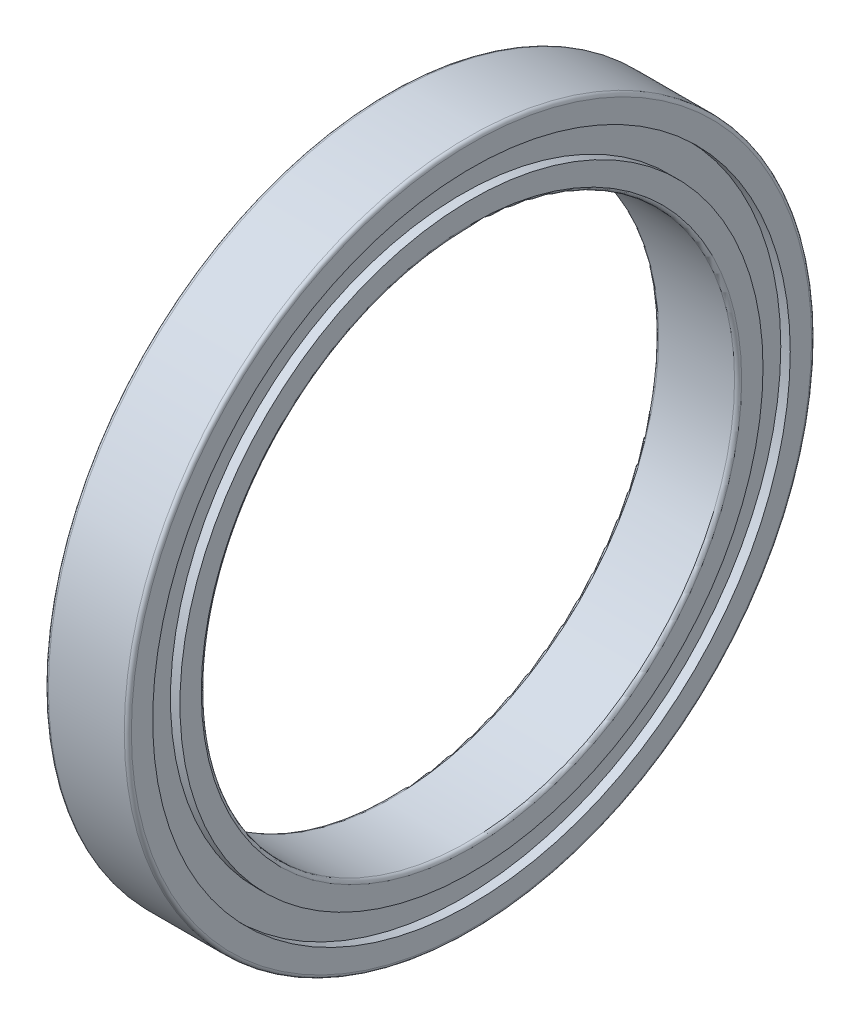
ISO-10303-21;
HEADER;
FILE_DESCRIPTION(('STEP AP214'),'2;1');
FILE_NAME('part.step','',(''),(''),'','','');
FILE_SCHEMA(('AUTOMOTIVE_DESIGN { 1 0 10303 214 1 1 1 1 }'));
ENDSEC;
DATA;
#1=APPLICATION_CONTEXT('core data for automotive mechanical design processes');
#2=APPLICATION_PROTOCOL_DEFINITION('international standard','automotive_design',2000,#1);
#3=PRODUCT_CONTEXT('',#1,'mechanical');
#4=PRODUCT('Part','Part','',(#3));
#5=PRODUCT_RELATED_PRODUCT_CATEGORY('part','',(#4));
#6=PRODUCT_DEFINITION_FORMATION('','',#4);
#7=PRODUCT_DEFINITION_CONTEXT('part definition',#1,'design');
#8=PRODUCT_DEFINITION('design','',#6,#7);
#9=PRODUCT_DEFINITION_SHAPE('','',#8);
#10=(LENGTH_UNIT() NAMED_UNIT(*) SI_UNIT(.MILLI.,.METRE.));
#11=(NAMED_UNIT(*) PLANE_ANGLE_UNIT() SI_UNIT($,.RADIAN.));
#12=(NAMED_UNIT(*) SI_UNIT($,.STERADIAN.) SOLID_ANGLE_UNIT());
#13=UNCERTAINTY_MEASURE_WITH_UNIT(LENGTH_MEASURE(1.E-05),#10,'distance_accuracy_value','');
#14=(GEOMETRIC_REPRESENTATION_CONTEXT(3) GLOBAL_UNCERTAINTY_ASSIGNED_CONTEXT((#13)) GLOBAL_UNIT_ASSIGNED_CONTEXT((#10,
#11,#12)) REPRESENTATION_CONTEXT('',''));
#15=CARTESIAN_POINT('',(0.,0.,0.));
#16=DIRECTION('',(0.,0.,1.));
#17=DIRECTION('',(1.,0.,0.));
#18=AXIS2_PLACEMENT_3D('',#15,#16,#17);
#19=CARTESIAN_POINT('',(-3.2,0.,0.));
#20=DIRECTION('',(1.,0.,0.));
#21=DIRECTION('',(0.,0.,-1.));
#22=AXIS2_PLACEMENT_3D('',#19,#20,#21);
#23=TOROIDAL_SURFACE('',#22,28.7,0.3);
#24=CARTESIAN_POINT('',(-3.5,0.,0.));
#25=DIRECTION('',(1.,0.,0.));
#26=DIRECTION('',(0.,0.,-1.));
#27=AXIS2_PLACEMENT_3D('',#24,#25,#26);
#28=CIRCLE('',#27,28.7);
#29=CARTESIAN_POINT('',(-3.5,0.,-28.7));
#30=VERTEX_POINT('',#29);
#31=EDGE_CURVE('E10',#30,#30,#28,.T.);
#32=ORIENTED_EDGE('',*,*,#31,.T.);
#33=EDGE_LOOP('',(#32));
#34=FACE_BOUND('',#33,.T.);
#35=CARTESIAN_POINT('',(-3.2,0.,0.));
#36=DIRECTION('',(1.,0.,0.));
#37=DIRECTION('',(0.,0.,-1.));
#38=AXIS2_PLACEMENT_3D('',#35,#36,#37);
#39=CIRCLE('',#38,29.);
#40=CARTESIAN_POINT('',(-3.2,0.,-29.));
#41=VERTEX_POINT('',#40);
#42=EDGE_CURVE('E116',#41,#41,#39,.T.);
#43=ORIENTED_EDGE('',*,*,#42,.F.);
#44=EDGE_LOOP('',(#43));
#45=FACE_BOUND('',#44,.T.);
#46=ADVANCED_FACE('F15',(#34,#45),#23,.T.);
#47=CARTESIAN_POINT('',(-3.5,26.9,0.));
#48=DIRECTION('',(1.,0.,0.));
#49=DIRECTION('',(0.,1.,0.));
#50=AXIS2_PLACEMENT_3D('',#47,#48,#49);
#51=PLANE('',#50);
#52=CARTESIAN_POINT('',(-3.5,0.,0.));
#53=DIRECTION('',(1.,0.,0.));
#54=DIRECTION('',(0.,0.,-1.));
#55=AXIS2_PLACEMENT_3D('',#52,#53,#54);
#56=CIRCLE('',#55,26.9);
#57=CARTESIAN_POINT('',(-3.5,0.,-26.9));
#58=VERTEX_POINT('',#57);
#59=EDGE_CURVE('E25',#58,#58,#56,.T.);
#60=ORIENTED_EDGE('',*,*,#59,.T.);
#61=EDGE_LOOP('',(#60));
#62=FACE_BOUND('',#61,.T.);
#63=ORIENTED_EDGE('',*,*,#31,.F.);
#64=EDGE_LOOP('',(#63));
#65=FACE_BOUND('',#64,.T.);
#66=ADVANCED_FACE('F187',(#62,#65),#51,.F.);
#67=CARTESIAN_POINT('',(3.5,0.,0.));
#68=DIRECTION('',(-1.,0.,0.));
#69=DIRECTION('',(0.,0.,-1.));
#70=AXIS2_PLACEMENT_3D('',#67,#68,#69);
#71=CYLINDRICAL_SURFACE('',#70,26.9);
#72=ORIENTED_EDGE('',*,*,#59,.F.);
#73=EDGE_LOOP('',(#72));
#74=FACE_BOUND('',#73,.T.);
#75=CARTESIAN_POINT('',(-2.7,0.,0.));
#76=DIRECTION('',(1.,0.,0.));
#77=DIRECTION('',(0.,0.,-1.));
#78=AXIS2_PLACEMENT_3D('',#75,#76,#77);
#79=CIRCLE('',#78,26.9);
#80=CARTESIAN_POINT('',(-2.7,0.,-26.9));
#81=VERTEX_POINT('',#80);
#82=EDGE_CURVE('E96',#81,#81,#79,.T.);
#83=ORIENTED_EDGE('',*,*,#82,.T.);
#84=EDGE_LOOP('',(#83));
#85=FACE_BOUND('',#84,.T.);
#86=ADVANCED_FACE('F192',(#74,#85),#71,.F.);
#87=CARTESIAN_POINT('',(-2.7,24.6,0.));
#88=DIRECTION('',(1.,0.,0.));
#89=DIRECTION('',(0.,1.,0.));
#90=AXIS2_PLACEMENT_3D('',#87,#88,#89);
#91=PLANE('',#90);
#92=CARTESIAN_POINT('',(-2.7,0.,0.));
#93=DIRECTION('',(1.,0.,0.));
#94=DIRECTION('',(0.,0.,-1.));
#95=AXIS2_PLACEMENT_3D('',#92,#93,#94);
#96=CIRCLE('',#95,24.6);
#97=CARTESIAN_POINT('',(-2.7,0.,-24.6));
#98=VERTEX_POINT('',#97);
#99=EDGE_CURVE('E103',#98,#98,#96,.T.);
#100=ORIENTED_EDGE('',*,*,#99,.T.);
#101=EDGE_LOOP('',(#100));
#102=FACE_BOUND('',#101,.T.);
#103=ORIENTED_EDGE('',*,*,#82,.F.);
#104=EDGE_LOOP('',(#103));
#105=FACE_BOUND('',#104,.T.);
#106=ADVANCED_FACE('F203',(#102,#105),#91,.F.);
#107=CARTESIAN_POINT('',(3.2,0.,0.));
#108=DIRECTION('',(1.,0.,0.));
#109=DIRECTION('',(0.,0.,-1.));
#110=AXIS2_PLACEMENT_3D('',#107,#108,#109);
#111=TOROIDAL_SURFACE('',#110,22.8,0.3);
#112=CARTESIAN_POINT('',(3.5,0.,0.));
#113=DIRECTION('',(1.,0.,0.));
#114=DIRECTION('',(0.,0.,-1.));
#115=AXIS2_PLACEMENT_3D('',#112,#113,#114);
#116=CIRCLE('',#115,22.8);
#117=CARTESIAN_POINT('',(3.5,0.,-22.8));
#118=VERTEX_POINT('',#117);
#119=EDGE_CURVE('E136',#118,#118,#116,.T.);
#120=ORIENTED_EDGE('',*,*,#119,.T.);
#121=EDGE_LOOP('',(#120));
#122=FACE_BOUND('',#121,.T.);
#123=CARTESIAN_POINT('',(3.2,0.,0.));
#124=DIRECTION('',(1.,0.,0.));
#125=DIRECTION('',(0.,0.,-1.));
#126=AXIS2_PLACEMENT_3D('',#123,#124,#125);
#127=CIRCLE('',#126,22.5);
#128=CARTESIAN_POINT('',(3.2,0.,-22.5));
#129=VERTEX_POINT('',#128);
#130=EDGE_CURVE('E18',#129,#129,#127,.T.);
#131=ORIENTED_EDGE('',*,*,#130,.F.);
#132=EDGE_LOOP('',(#131));
#133=FACE_BOUND('',#132,.T.);
#134=ADVANCED_FACE('F211',(#122,#133),#111,.T.);
#135=CARTESIAN_POINT('',(50.,0.,0.));
#136=DIRECTION('',(-1.,0.,0.));
#137=DIRECTION('',(0.,0.,-1.));
#138=AXIS2_PLACEMENT_3D('',#135,#136,#137);
#139=CYLINDRICAL_SURFACE('',#138,22.5);
#140=ORIENTED_EDGE('',*,*,#130,.T.);
#141=EDGE_LOOP('',(#140));
#142=FACE_BOUND('',#141,.T.);
#143=CARTESIAN_POINT('',(-3.2,0.,0.));
#144=DIRECTION('',(1.,0.,0.));
#145=DIRECTION('',(0.,0.,-1.));
#146=AXIS2_PLACEMENT_3D('',#143,#144,#145);
#147=CIRCLE('',#146,22.5);
#148=CARTESIAN_POINT('',(-3.2,0.,-22.5));
#149=VERTEX_POINT('',#148);
#150=EDGE_CURVE('E97',#149,#149,#147,.T.);
#151=ORIENTED_EDGE('',*,*,#150,.F.);
#152=EDGE_LOOP('',(#151));
#153=FACE_BOUND('',#152,.T.);
#154=ADVANCED_FACE('F92',(#142,#153),#139,.F.);
#155=CARTESIAN_POINT('',(-3.2,0.,0.));
#156=DIRECTION('',(1.,0.,0.));
#157=DIRECTION('',(0.,0.,-1.));
#158=AXIS2_PLACEMENT_3D('',#155,#156,#157);
#159=TOROIDAL_SURFACE('',#158,22.8,0.3);
#160=ORIENTED_EDGE('',*,*,#150,.T.);
#161=EDGE_LOOP('',(#160));
#162=FACE_BOUND('',#161,.T.);
#163=CARTESIAN_POINT('',(-3.5,0.,0.));
#164=DIRECTION('',(1.,0.,0.));
#165=DIRECTION('',(0.,0.,-1.));
#166=AXIS2_PLACEMENT_3D('',#163,#164,#165);
#167=CIRCLE('',#166,22.8);
#168=CARTESIAN_POINT('',(-3.5,0.,-22.8));
#169=VERTEX_POINT('',#168);
#170=EDGE_CURVE('E109',#169,#169,#167,.T.);
#171=ORIENTED_EDGE('',*,*,#170,.F.);
#172=EDGE_LOOP('',(#171));
#173=FACE_BOUND('',#172,.T.);
#174=ADVANCED_FACE('F208',(#162,#173),#159,.T.);
#175=CARTESIAN_POINT('',(3.5,0.,0.));
#176=DIRECTION('',(-1.,0.,0.));
#177=DIRECTION('',(0.,0.,-1.));
#178=AXIS2_PLACEMENT_3D('',#175,#176,#177);
#179=CYLINDRICAL_SURFACE('',#178,24.6);
#180=ORIENTED_EDGE('',*,*,#99,.F.);
#181=EDGE_LOOP('',(#180));
#182=FACE_BOUND('',#181,.T.);
#183=CARTESIAN_POINT('',(-3.5,0.,0.));
#184=DIRECTION('',(1.,0.,0.));
#185=DIRECTION('',(0.,0.,-1.));
#186=AXIS2_PLACEMENT_3D('',#183,#184,#185);
#187=CIRCLE('',#186,24.6);
#188=CARTESIAN_POINT('',(-3.5,0.,-24.6));
#189=VERTEX_POINT('',#188);
#190=EDGE_CURVE('E113',#189,#189,#187,.T.);
#191=ORIENTED_EDGE('',*,*,#190,.T.);
#192=EDGE_LOOP('',(#191));
#193=FACE_BOUND('',#192,.T.);
#194=ADVANCED_FACE('F223',(#182,#193),#179,.T.);
#195=CARTESIAN_POINT('',(-3.5,0.,0.));
#196=DIRECTION('',(1.,0.,0.));
#197=DIRECTION('',(0.,1.,0.));
#198=AXIS2_PLACEMENT_3D('',#195,#196,#197);
#199=PLANE('',#198);
#200=ORIENTED_EDGE('',*,*,#170,.T.);
#201=EDGE_LOOP('',(#200));
#202=FACE_BOUND('',#201,.T.);
#203=ORIENTED_EDGE('',*,*,#190,.F.);
#204=EDGE_LOOP('',(#203));
#205=FACE_BOUND('',#204,.T.);
#206=ADVANCED_FACE('F182',(#202,#205),#199,.F.);
#207=CARTESIAN_POINT('',(3.5,0.,0.));
#208=DIRECTION('',(-1.,0.,0.));
#209=DIRECTION('',(0.,0.,-1.));
#210=AXIS2_PLACEMENT_3D('',#207,#208,#209);
#211=CYLINDRICAL_SURFACE('',#210,29.);
#212=CARTESIAN_POINT('',(3.2,0.,0.));
#213=DIRECTION('',(1.,0.,0.));
#214=DIRECTION('',(0.,0.,-1.));
#215=AXIS2_PLACEMENT_3D('',#212,#213,#214);
#216=CIRCLE('',#215,29.);
#217=CARTESIAN_POINT('',(3.2,0.,-29.));
#218=VERTEX_POINT('',#217);
#219=EDGE_CURVE('E117',#218,#218,#216,.T.);
#220=ORIENTED_EDGE('',*,*,#219,.F.);
#221=EDGE_LOOP('',(#220));
#222=FACE_BOUND('',#221,.T.);
#223=ORIENTED_EDGE('',*,*,#42,.T.);
#224=EDGE_LOOP('',(#223));
#225=FACE_BOUND('',#224,.T.);
#226=ADVANCED_FACE('F173',(#222,#225),#211,.T.);
#227=CARTESIAN_POINT('',(3.2,0.,0.));
#228=DIRECTION('',(1.,0.,0.));
#229=DIRECTION('',(0.,0.,-1.));
#230=AXIS2_PLACEMENT_3D('',#227,#228,#229);
#231=TOROIDAL_SURFACE('',#230,28.7,0.3);
#232=ORIENTED_EDGE('',*,*,#219,.T.);
#233=EDGE_LOOP('',(#232));
#234=FACE_BOUND('',#233,.T.);
#235=CARTESIAN_POINT('',(3.5,0.,0.));
#236=DIRECTION('',(1.,0.,0.));
#237=DIRECTION('',(0.,0.,-1.));
#238=AXIS2_PLACEMENT_3D('',#235,#236,#237);
#239=CIRCLE('',#238,28.7);
#240=CARTESIAN_POINT('',(3.5,0.,-28.7));
#241=VERTEX_POINT('',#240);
#242=EDGE_CURVE('E120',#241,#241,#239,.T.);
#243=ORIENTED_EDGE('',*,*,#242,.F.);
#244=EDGE_LOOP('',(#243));
#245=FACE_BOUND('',#244,.T.);
#246=ADVANCED_FACE('F168',(#234,#245),#231,.T.);
#247=CARTESIAN_POINT('',(3.5,28.7,0.));
#248=DIRECTION('',(-1.,0.,0.));
#249=DIRECTION('',(0.,0.,1.));
#250=AXIS2_PLACEMENT_3D('',#247,#248,#249);
#251=PLANE('',#250);
#252=CARTESIAN_POINT('',(3.5,0.,0.));
#253=DIRECTION('',(1.,0.,0.));
#254=DIRECTION('',(0.,0.,-1.));
#255=AXIS2_PLACEMENT_3D('',#252,#253,#254);
#256=CIRCLE('',#255,26.9);
#257=CARTESIAN_POINT('',(3.5,0.,-26.9));
#258=VERTEX_POINT('',#257);
#259=EDGE_CURVE('E125',#258,#258,#256,.T.);
#260=ORIENTED_EDGE('',*,*,#259,.F.);
#261=EDGE_LOOP('',(#260));
#262=FACE_BOUND('',#261,.T.);
#263=ORIENTED_EDGE('',*,*,#242,.T.);
#264=EDGE_LOOP('',(#263));
#265=FACE_BOUND('',#264,.T.);
#266=ADVANCED_FACE('F162',(#262,#265),#251,.F.);
#267=CARTESIAN_POINT('',(3.5,0.,0.));
#268=DIRECTION('',(-1.,0.,0.));
#269=DIRECTION('',(0.,0.,-1.));
#270=AXIS2_PLACEMENT_3D('',#267,#268,#269);
#271=CYLINDRICAL_SURFACE('',#270,26.9);
#272=CARTESIAN_POINT('',(2.7,0.,0.));
#273=DIRECTION('',(1.,0.,0.));
#274=DIRECTION('',(0.,0.,-1.));
#275=AXIS2_PLACEMENT_3D('',#272,#273,#274);
#276=CIRCLE('',#275,26.9);
#277=CARTESIAN_POINT('',(2.7,0.,-26.9));
#278=VERTEX_POINT('',#277);
#279=EDGE_CURVE('E130',#278,#278,#276,.T.);
#280=ORIENTED_EDGE('',*,*,#279,.F.);
#281=EDGE_LOOP('',(#280));
#282=FACE_BOUND('',#281,.T.);
#283=ORIENTED_EDGE('',*,*,#259,.T.);
#284=EDGE_LOOP('',(#283));
#285=FACE_BOUND('',#284,.T.);
#286=ADVANCED_FACE('F156',(#282,#285),#271,.F.);
#287=CARTESIAN_POINT('',(2.7,26.9,0.));
#288=DIRECTION('',(-1.,0.,0.));
#289=DIRECTION('',(0.,0.,1.));
#290=AXIS2_PLACEMENT_3D('',#287,#288,#289);
#291=PLANE('',#290);
#292=CARTESIAN_POINT('',(2.7,0.,0.));
#293=DIRECTION('',(1.,0.,0.));
#294=DIRECTION('',(0.,0.,-1.));
#295=AXIS2_PLACEMENT_3D('',#292,#293,#294);
#296=CIRCLE('',#295,24.6);
#297=CARTESIAN_POINT('',(2.7,0.,-24.6));
#298=VERTEX_POINT('',#297);
#299=EDGE_CURVE('E133',#298,#298,#296,.T.);
#300=ORIENTED_EDGE('',*,*,#299,.F.);
#301=EDGE_LOOP('',(#300));
#302=FACE_BOUND('',#301,.T.);
#303=ORIENTED_EDGE('',*,*,#279,.T.);
#304=EDGE_LOOP('',(#303));
#305=FACE_BOUND('',#304,.T.);
#306=ADVANCED_FACE('F150',(#302,#305),#291,.F.);
#307=CARTESIAN_POINT('',(3.5,0.,0.));
#308=DIRECTION('',(-1.,0.,0.));
#309=DIRECTION('',(0.,0.,-1.));
#310=AXIS2_PLACEMENT_3D('',#307,#308,#309);
#311=CYLINDRICAL_SURFACE('',#310,24.6);
#312=CARTESIAN_POINT('',(3.5,0.,0.));
#313=DIRECTION('',(1.,0.,0.));
#314=DIRECTION('',(0.,0.,-1.));
#315=AXIS2_PLACEMENT_3D('',#312,#313,#314);
#316=CIRCLE('',#315,24.6);
#317=CARTESIAN_POINT('',(3.5,0.,-24.6));
#318=VERTEX_POINT('',#317);
#319=EDGE_CURVE('E138',#318,#318,#316,.T.);
#320=ORIENTED_EDGE('',*,*,#319,.F.);
#321=EDGE_LOOP('',(#320));
#322=FACE_BOUND('',#321,.T.);
#323=ORIENTED_EDGE('',*,*,#299,.T.);
#324=EDGE_LOOP('',(#323));
#325=FACE_BOUND('',#324,.T.);
#326=ADVANCED_FACE('F147',(#322,#325),#311,.T.);
#327=CARTESIAN_POINT('',(3.5,24.6,0.));
#328=DIRECTION('',(-1.,0.,0.));
#329=DIRECTION('',(0.,0.,1.));
#330=AXIS2_PLACEMENT_3D('',#327,#328,#329);
#331=PLANE('',#330);
#332=ORIENTED_EDGE('',*,*,#119,.F.);
#333=EDGE_LOOP('',(#332));
#334=FACE_BOUND('',#333,.T.);
#335=ORIENTED_EDGE('',*,*,#319,.T.);
#336=EDGE_LOOP('',(#335));
#337=FACE_BOUND('',#336,.T.);
#338=ADVANCED_FACE('F145',(#334,#337),#331,.F.);
#339=CLOSED_SHELL('',(#46,#66,#86,#106,#134,#154,#174,#194,#206,#226,#246,#266,#286,#306,#326,#338));
#340=MANIFOLD_SOLID_BREP('B1',#339);
#341=ADVANCED_BREP_SHAPE_REPRESENTATION('',(#18,#340),#14);
#342=SHAPE_DEFINITION_REPRESENTATION(#9,#341);
ENDSEC;
END-ISO-10303-21;
